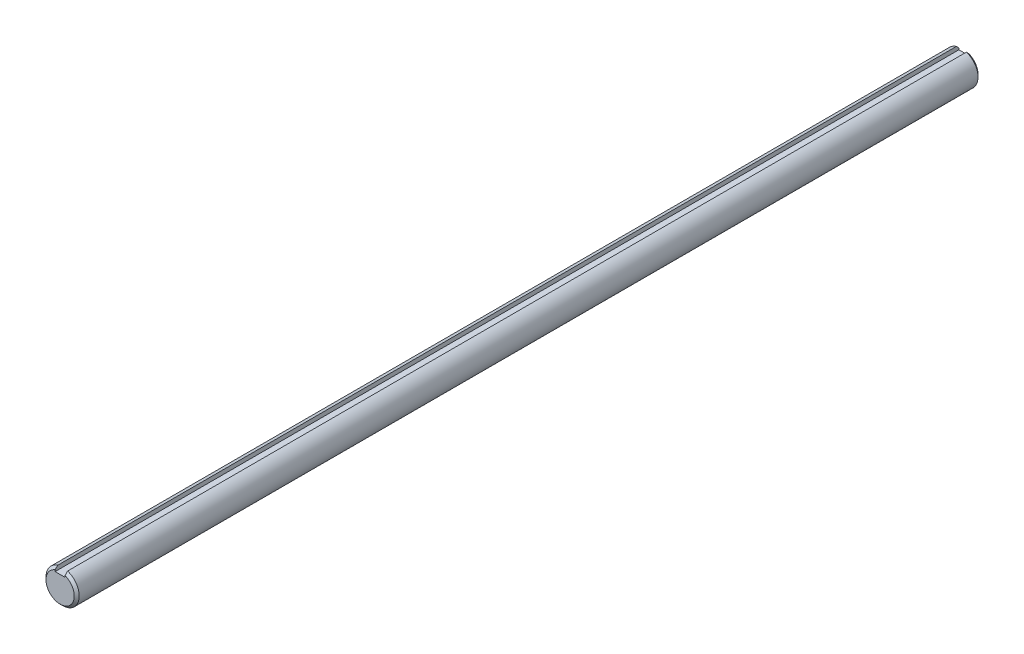
ISO-10303-21;
HEADER;
FILE_DESCRIPTION(('STEP AP214'),'2;1');
FILE_NAME('part.step','',(''),(''),'','','');
FILE_SCHEMA(('AUTOMOTIVE_DESIGN { 1 0 10303 214 1 1 1 1 }'));
ENDSEC;
DATA;
#1=APPLICATION_CONTEXT('core data for automotive mechanical design processes');
#2=APPLICATION_PROTOCOL_DEFINITION('international standard','automotive_design',2000,#1);
#3=PRODUCT_CONTEXT('',#1,'mechanical');
#4=PRODUCT('Part','Part','',(#3));
#5=PRODUCT_RELATED_PRODUCT_CATEGORY('part','',(#4));
#6=PRODUCT_DEFINITION_FORMATION('','',#4);
#7=PRODUCT_DEFINITION_CONTEXT('part definition',#1,'design');
#8=PRODUCT_DEFINITION('design','',#6,#7);
#9=PRODUCT_DEFINITION_SHAPE('','',#8);
#10=(LENGTH_UNIT() NAMED_UNIT(*) SI_UNIT(.MILLI.,.METRE.));
#11=(NAMED_UNIT(*) PLANE_ANGLE_UNIT() SI_UNIT($,.RADIAN.));
#12=(NAMED_UNIT(*) SI_UNIT($,.STERADIAN.) SOLID_ANGLE_UNIT());
#13=UNCERTAINTY_MEASURE_WITH_UNIT(LENGTH_MEASURE(1.E-05),#10,'distance_accuracy_value','');
#14=(GEOMETRIC_REPRESENTATION_CONTEXT(3) GLOBAL_UNCERTAINTY_ASSIGNED_CONTEXT((#13)) GLOBAL_UNIT_ASSIGNED_CONTEXT((#10,
#11,#12)) REPRESENTATION_CONTEXT('',''));
#15=CARTESIAN_POINT('',(0.,0.,0.));
#16=DIRECTION('',(0.,0.,1.));
#17=DIRECTION('',(1.,0.,0.));
#18=AXIS2_PLACEMENT_3D('',#15,#16,#17);
#19=CARTESIAN_POINT('',(0.,0.,107.95));
#20=DIRECTION('',(0.,0.,-1.));
#21=DIRECTION('',(-1.,0.,0.));
#22=AXIS2_PLACEMENT_3D('',#19,#20,#21);
#23=CYLINDRICAL_SURFACE('',#22,3.96875);
#24=CARTESIAN_POINT('',(0.,0.,107.3546875));
#25=DIRECTION('',(0.,0.,1.));
#26=DIRECTION('',(1.,0.,0.));
#27=AXIS2_PLACEMENT_3D('',#24,#25,#26);
#28=CIRCLE('',#27,3.96875);
#29=CARTESIAN_POINT('',(1.190625,3.7859462056235,107.3546875));
#30=VERTEX_POINT('',#29);
#31=CARTESIAN_POINT('',(-1.190625,3.7859462056235,107.3546875));
#32=VERTEX_POINT('',#31);
#33=EDGE_CURVE('E155',#30,#32,#28,.F.);
#34=ORIENTED_EDGE('',*,*,#33,.T.);
#35=DIRECTION('',(0.,0.,-1.));
#36=VECTOR('',#35,1.);
#37=CARTESIAN_POINT('',(-1.190625,3.7859462056235,107.95));
#38=LINE('',#37,#36);
#39=CARTESIAN_POINT('',(-1.190625,3.7859462056235,-107.3546875));
#40=VERTEX_POINT('',#39);
#41=EDGE_CURVE('E132',#32,#40,#38,.T.);
#42=ORIENTED_EDGE('',*,*,#41,.T.);
#43=CARTESIAN_POINT('',(0.,0.,-107.3546875));
#44=DIRECTION('',(0.,0.,1.));
#45=DIRECTION('',(1.,0.,0.));
#46=AXIS2_PLACEMENT_3D('',#43,#44,#45);
#47=CIRCLE('',#46,3.96875);
#48=CARTESIAN_POINT('',(1.190625,3.7859462056235,-107.3546875));
#49=VERTEX_POINT('',#48);
#50=EDGE_CURVE('E152',#40,#49,#47,.T.);
#51=ORIENTED_EDGE('',*,*,#50,.T.);
#52=DIRECTION('',(0.,0.,-1.));
#53=VECTOR('',#52,1.);
#54=CARTESIAN_POINT('',(1.190625,3.7859462056235,107.95));
#55=LINE('',#54,#53);
#56=EDGE_CURVE('E121',#49,#30,#55,.F.);
#57=ORIENTED_EDGE('',*,*,#56,.T.);
#58=EDGE_LOOP('',(#34,#42,#51,#57));
#59=FACE_BOUND('',#58,.T.);
#60=ADVANCED_FACE('F35',(#59),#23,.T.);
#61=CARTESIAN_POINT('',(0.,0.,107.95));
#62=DIRECTION('',(0.,0.,1.));
#63=DIRECTION('',(1.,0.,0.));
#64=AXIS2_PLACEMENT_3D('',#61,#62,#63);
#65=PLANE('',#64);
#66=DIRECTION('',(0.,-1.,0.));
#67=VECTOR('',#66,1.);
#68=CARTESIAN_POINT('',(-1.190625,3.96875,107.95));
#69=LINE('',#68,#67);
#70=CARTESIAN_POINT('',(-1.190625,3.15634166017892,107.95));
#71=VERTEX_POINT('',#70);
#72=CARTESIAN_POINT('',(-1.190625,2.778125,107.95));
#73=VERTEX_POINT('',#72);
#74=EDGE_CURVE('E91',#71,#73,#69,.T.);
#75=ORIENTED_EDGE('',*,*,#74,.F.);
#76=CARTESIAN_POINT('',(0.,0.,107.95));
#77=DIRECTION('',(0.,0.,1.));
#78=DIRECTION('',(1.,0.,0.));
#79=AXIS2_PLACEMENT_3D('',#76,#77,#78);
#80=CIRCLE('',#79,3.37343749999997);
#81=CARTESIAN_POINT('',(1.190625,3.15634166017892,107.95));
#82=VERTEX_POINT('',#81);
#83=EDGE_CURVE('E147',#71,#82,#80,.T.);
#84=ORIENTED_EDGE('',*,*,#83,.T.);
#85=DIRECTION('',(0.,1.,0.));
#86=VECTOR('',#85,1.);
#87=CARTESIAN_POINT('',(1.190625,3.96875,107.95));
#88=LINE('',#87,#86);
#89=CARTESIAN_POINT('',(1.190625,2.778125,107.95));
#90=VERTEX_POINT('',#89);
#91=EDGE_CURVE('E56',#90,#82,#88,.T.);
#92=ORIENTED_EDGE('',*,*,#91,.F.);
#93=DIRECTION('',(1.,0.,0.));
#94=VECTOR('',#93,1.);
#95=CARTESIAN_POINT('',(-1.190625,2.778125,107.95));
#96=LINE('',#95,#94);
#97=EDGE_CURVE('E101',#73,#90,#96,.T.);
#98=ORIENTED_EDGE('',*,*,#97,.F.);
#99=EDGE_LOOP('',(#75,#84,#92,#98));
#100=FACE_BOUND('',#99,.T.);
#101=ADVANCED_FACE('F112',(#100),#65,.T.);
#102=CARTESIAN_POINT('',(0.,0.,-107.95));
#103=DIRECTION('',(0.,0.,1.));
#104=DIRECTION('',(1.,0.,0.));
#105=AXIS2_PLACEMENT_3D('',#102,#103,#104);
#106=PLANE('',#105);
#107=CARTESIAN_POINT('',(0.,0.,-107.95));
#108=DIRECTION('',(0.,0.,1.));
#109=DIRECTION('',(1.,0.,0.));
#110=AXIS2_PLACEMENT_3D('',#107,#108,#109);
#111=CIRCLE('',#110,3.37343749999994);
#112=CARTESIAN_POINT('',(1.190625,3.15634166017889,-107.95));
#113=VERTEX_POINT('',#112);
#114=CARTESIAN_POINT('',(-1.190625,3.15634166017889,-107.95));
#115=VERTEX_POINT('',#114);
#116=EDGE_CURVE('E149',#113,#115,#111,.F.);
#117=ORIENTED_EDGE('',*,*,#116,.T.);
#118=DIRECTION('',(0.,-1.,0.));
#119=VECTOR('',#118,1.);
#120=CARTESIAN_POINT('',(-1.190625,3.96875,-107.95));
#121=LINE('',#120,#119);
#122=CARTESIAN_POINT('',(-1.190625,2.778125,-107.95));
#123=VERTEX_POINT('',#122);
#124=EDGE_CURVE('E114',#115,#123,#121,.T.);
#125=ORIENTED_EDGE('',*,*,#124,.T.);
#126=DIRECTION('',(1.,0.,0.));
#127=VECTOR('',#126,1.);
#128=CARTESIAN_POINT('',(-1.190625,2.778125,-107.95));
#129=LINE('',#128,#127);
#130=CARTESIAN_POINT('',(1.190625,2.778125,-107.95));
#131=VERTEX_POINT('',#130);
#132=EDGE_CURVE('E107',#123,#131,#129,.T.);
#133=ORIENTED_EDGE('',*,*,#132,.T.);
#134=DIRECTION('',(0.,1.,0.));
#135=VECTOR('',#134,1.);
#136=CARTESIAN_POINT('',(1.190625,3.96875,-107.95));
#137=LINE('',#136,#135);
#138=EDGE_CURVE('E110',#131,#113,#137,.T.);
#139=ORIENTED_EDGE('',*,*,#138,.T.);
#140=EDGE_LOOP('',(#117,#125,#133,#139));
#141=FACE_BOUND('',#140,.T.);
#142=ADVANCED_FACE('F167',(#141),#106,.F.);
#143=CARTESIAN_POINT('',(0.,0.,-107.3546875));
#144=DIRECTION('',(0.,0.,1.));
#145=DIRECTION('',(1.,0.,0.));
#146=AXIS2_PLACEMENT_3D('',#143,#144,#145);
#147=CONICAL_SURFACE('',#146,3.96875,0.785398163397454);
#148=CARTESIAN_POINT('',(-1.190625,1.2705074744525,-109.582237588081));
#149=CARTESIAN_POINT('',(-1.190625,1.33945024904548,-109.531868938439));
#150=CARTESIAN_POINT('',(-1.190625,1.40752613197202,-109.480346457148));
#151=CARTESIAN_POINT('',(-1.190625,1.54227424816376,-109.375529482326));
#152=CARTESIAN_POINT('',(-1.190625,1.60894684967617,-109.322235463392));
#153=CARTESIAN_POINT('',(-1.190625,1.74121608357416,-109.214415306958));
#154=CARTESIAN_POINT('',(-1.190625,1.80681332303188,-109.159889909066));
#155=CARTESIAN_POINT('',(-1.190625,1.93719861894641,-109.049871504209));
#156=CARTESIAN_POINT('',(-1.190625,2.00198661313571,-108.994378423563));
#157=CARTESIAN_POINT('',(-1.190625,2.19528235369314,-108.826902563142));
#158=CARTESIAN_POINT('',(-1.190625,2.32284027776798,-108.713825177904));
#159=CARTESIAN_POINT('',(-1.190625,2.57632456032826,-108.485833314422));
#160=CARTESIAN_POINT('',(-1.190625,2.70225069588487,-108.370918589859));
#161=CARTESIAN_POINT('',(-1.190625,2.90117256513785,-108.187583111563));
#162=CARTESIAN_POINT('',(-1.190625,2.97454261353847,-108.119567727347));
#163=CARTESIAN_POINT('',(-1.190625,3.12096669374044,-107.98318126116));
#164=CARTESIAN_POINT('',(-1.190625,3.194020688981,-107.914810139951));
#165=CARTESIAN_POINT('',(-1.190625,3.42754855543194,-107.695403028298));
#166=CARTESIAN_POINT('',(-1.190625,3.58751214790997,-107.54382403118));
#167=CARTESIAN_POINT('',(-1.190625,3.9065646384522,-107.239747690829));
#168=CARTESIAN_POINT('',(-1.190625,4.06565352943566,-107.087250340184));
#169=CARTESIAN_POINT('',(-1.190625,4.38313242821709,-106.781678673975));
#170=CARTESIAN_POINT('',(-1.190625,4.54152272817578,-106.628604661738));
#171=CARTESIAN_POINT('',(-1.190625,4.85782857925871,-106.321974315725));
#172=CARTESIAN_POINT('',(-1.190625,5.0157441416509,-106.168417993577));
#173=CARTESIAN_POINT('',(-1.190625,5.17350075106821,-106.014699616856));
#174=B_SPLINE_CURVE_WITH_KNOTS('',3,(#148,#149,#150,#151,#152,#153,#154,#155,#156,#157,#158,
#159,#160,#161,#162,#163,#164,#165,#166,#167,#168,#169,#170,#171,#172,#173),.UNSPECIFIED.,.F.,
.F.,(4,2,2,2,2,2,2,2,2,2,2,2,4),(0.,0.256106549070278,0.512145031259662,0.768033616188476,
1.02394177069293,1.53529710027226,2.04672156801998,2.3468592131894,2.64703069635681,
3.30814528195856,3.96926521146619,4.63007582380794,5.29087062592851),.UNSPECIFIED.);
#175=EDGE_CURVE('E64',#115,#40,#174,.T.);
#176=ORIENTED_EDGE('',*,*,#175,.F.);
#177=ORIENTED_EDGE('',*,*,#116,.F.);
#178=CARTESIAN_POINT('',(1.190625,5.17350075106821,-106.014699616856));
#179=CARTESIAN_POINT('',(1.190625,5.01564874806207,-106.168511472319));
#180=CARTESIAN_POINT('',(1.190625,4.85763728715372,-106.322160583231));
#181=CARTESIAN_POINT('',(1.190625,4.54115596675193,-106.628959355939));
#182=CARTESIAN_POINT('',(1.190625,4.38268614660585,-106.782109058337));
#183=CARTESIAN_POINT('',(1.190625,4.06522276267555,-107.087664113955));
#184=CARTESIAN_POINT('',(1.190625,3.90622959354944,-107.240069876704));
#185=CARTESIAN_POINT('',(1.190625,3.58735074633396,-107.54397497985));
#186=CARTESIAN_POINT('',(1.190625,3.42746498744949,-107.695474235536));
#187=CARTESIAN_POINT('',(1.190625,3.10626227314188,-107.997269372935));
#188=CARTESIAN_POINT('',(1.190625,2.94494407029081,-108.147563931976));
#189=CARTESIAN_POINT('',(1.190625,2.70149890471547,-108.371373606125));
#190=CARTESIAN_POINT('',(1.190625,2.62011511899482,-108.445696526585));
#191=CARTESIAN_POINT('',(1.190625,2.45670633738342,-108.593641789475));
#192=CARTESIAN_POINT('',(1.190625,2.37468131578876,-108.667264103556));
#193=CARTESIAN_POINT('',(1.190625,2.20973257977102,-108.813645127679));
#194=CARTESIAN_POINT('',(1.190625,2.12680813490424,-108.886403016633));
#195=CARTESIAN_POINT('',(1.190625,1.95987008893629,-109.030642128344));
#196=CARTESIAN_POINT('',(1.190625,1.87585661113062,-109.102123493484));
#197=CARTESIAN_POINT('',(1.190625,1.70627140047754,-109.243357240029));
#198=CARTESIAN_POINT('',(1.190625,1.62069854908277,-109.313108288189));
#199=CARTESIAN_POINT('',(1.190625,1.490751438306,-109.415762040513));
#200=CARTESIAN_POINT('',(1.190625,1.44716267308548,-109.449657399673));
#201=CARTESIAN_POINT('',(1.190625,1.35934334622596,-109.516616073488));
#202=CARTESIAN_POINT('',(1.190625,1.31511270922793,-109.54967928918));
#203=CARTESIAN_POINT('',(1.190625,1.2705074744525,-109.582237588081));
#204=B_SPLINE_CURVE_WITH_KNOTS('',3,(#178,#179,#180,#181,#182,#183,#184,#185,#186,#187,#188,
#189,#190,#191,#192,#193,#194,#195,#196,#197,#198,#199,#200,#201,#202,#203),.UNSPECIFIED.,.F.,
.F.,(4,2,2,2,2,2,2,2,2,2,2,2,4),(0.,0.661195239000987,1.32233530998299,1.98305721589185,
2.64383993116428,3.30526927355018,3.63590949345567,3.96656303571753,4.29750891878851,
4.62841765531665,4.9595739066105,5.12521491207,5.29087552454029),.UNSPECIFIED.);
#205=EDGE_CURVE('E125',#49,#113,#204,.T.);
#206=ORIENTED_EDGE('',*,*,#205,.F.);
#207=ORIENTED_EDGE('',*,*,#50,.F.);
#208=EDGE_LOOP('',(#176,#177,#206,#207));
#209=FACE_BOUND('',#208,.T.);
#210=ADVANCED_FACE('F134',(#209),#147,.T.);
#211=CARTESIAN_POINT('',(0.,0.,107.95));
#212=DIRECTION('',(0.,0.,-1.));
#213=DIRECTION('',(-1.,0.,0.));
#214=AXIS2_PLACEMENT_3D('',#211,#212,#213);
#215=CONICAL_SURFACE('',#214,3.37343749999997,0.785398163397466);
#216=CARTESIAN_POINT('',(-1.190625,5.17350075106823,106.014699616856));
#217=CARTESIAN_POINT('',(-1.190625,5.0156487480621,106.168511472319));
#218=CARTESIAN_POINT('',(-1.190625,4.85763728715374,106.322160583231));
#219=CARTESIAN_POINT('',(-1.190625,4.54115596675196,106.628959355939));
#220=CARTESIAN_POINT('',(-1.190625,4.38268614660587,106.782109058337));
#221=CARTESIAN_POINT('',(-1.190625,4.06522276267557,107.087664113955));
#222=CARTESIAN_POINT('',(-1.190625,3.90622959354946,107.240069876704));
#223=CARTESIAN_POINT('',(-1.190625,3.58735074633397,107.54397497985));
#224=CARTESIAN_POINT('',(-1.190625,3.42746498744951,107.695474235536));
#225=CARTESIAN_POINT('',(-1.190625,3.10626227314189,107.997269372935));
#226=CARTESIAN_POINT('',(-1.190625,2.94494407029082,108.147563931976));
#227=CARTESIAN_POINT('',(-1.190625,2.70149890471548,108.371373606125));
#228=CARTESIAN_POINT('',(-1.190625,2.62011511899483,108.445696526585));
#229=CARTESIAN_POINT('',(-1.190625,2.45670633738343,108.593641789475));
#230=CARTESIAN_POINT('',(-1.190625,2.37468131578877,108.667264103556));
#231=CARTESIAN_POINT('',(-1.190625,2.20973257977104,108.813645127679));
#232=CARTESIAN_POINT('',(-1.190625,2.12680813490426,108.886403016633));
#233=CARTESIAN_POINT('',(-1.190625,1.9598700889363,109.030642128344));
#234=CARTESIAN_POINT('',(-1.190625,1.87585661113062,109.102123493484));
#235=CARTESIAN_POINT('',(-1.190625,1.70627140047756,109.243357240029));
#236=CARTESIAN_POINT('',(-1.190625,1.62069854908278,109.313108288189));
#237=CARTESIAN_POINT('',(-1.190625,1.49075143830601,109.415762040513));
#238=CARTESIAN_POINT('',(-1.190625,1.44716267308549,109.449657399673));
#239=CARTESIAN_POINT('',(-1.190625,1.35934334622596,109.516616073488));
#240=CARTESIAN_POINT('',(-1.190625,1.31511270922793,109.54967928918));
#241=CARTESIAN_POINT('',(-1.190625,1.27050747445251,109.582237588081));
#242=B_SPLINE_CURVE_WITH_KNOTS('',3,(#216,#217,#218,#219,#220,#221,#222,#223,#224,#225,#226,
#227,#228,#229,#230,#231,#232,#233,#234,#235,#236,#237,#238,#239,#240,#241),.UNSPECIFIED.,.F.,
.F.,(4,2,2,2,2,2,2,2,2,2,2,2,4),(0.,0.661195239000971,1.32233530998297,1.98305721589184,
2.64383993116425,3.30526927355016,3.63590949345565,3.9665630357175,4.29750891878847,
4.62841765531661,4.95957390661045,5.12521491206996,5.29087552454025),.UNSPECIFIED.);
#243=EDGE_CURVE('E11',#32,#71,#242,.T.);
#244=ORIENTED_EDGE('',*,*,#243,.F.);
#245=ORIENTED_EDGE('',*,*,#33,.F.);
#246=CARTESIAN_POINT('',(1.190625,1.27050747445251,109.582237588081));
#247=CARTESIAN_POINT('',(1.190625,1.33945024904549,109.531868938439));
#248=CARTESIAN_POINT('',(1.190625,1.40752613197203,109.480346457148));
#249=CARTESIAN_POINT('',(1.190625,1.54227424816377,109.375529482326));
#250=CARTESIAN_POINT('',(1.190625,1.60894684967617,109.322235463392));
#251=CARTESIAN_POINT('',(1.190625,1.74121608357416,109.214415306958));
#252=CARTESIAN_POINT('',(1.190625,1.80681332303189,109.159889909066));
#253=CARTESIAN_POINT('',(1.190625,1.93719861894641,109.049871504209));
#254=CARTESIAN_POINT('',(1.190625,2.00198661313572,108.994378423563));
#255=CARTESIAN_POINT('',(1.190625,2.19528235369314,108.826902563142));
#256=CARTESIAN_POINT('',(1.190625,2.32284027776798,108.713825177904));
#257=CARTESIAN_POINT('',(1.190625,2.57632456032828,108.485833314422));
#258=CARTESIAN_POINT('',(1.190625,2.70225069588489,108.370918589859));
#259=CARTESIAN_POINT('',(1.190625,2.90117256513788,108.187583111563));
#260=CARTESIAN_POINT('',(1.190625,2.97454261353849,108.119567727347));
#261=CARTESIAN_POINT('',(1.190625,3.12096669374046,107.98318126116));
#262=CARTESIAN_POINT('',(1.190625,3.19402068898102,107.914810139951));
#263=CARTESIAN_POINT('',(1.190625,3.42754855543196,107.695403028298));
#264=CARTESIAN_POINT('',(1.190625,3.58751214790999,107.54382403118));
#265=CARTESIAN_POINT('',(1.190625,3.90656463845222,107.239747690829));
#266=CARTESIAN_POINT('',(1.190625,4.06565352943568,107.087250340184));
#267=CARTESIAN_POINT('',(1.190625,4.38313242821712,106.781678673975));
#268=CARTESIAN_POINT('',(1.190625,4.5415227281758,106.628604661738));
#269=CARTESIAN_POINT('',(1.190625,4.85782857925873,106.321974315725));
#270=CARTESIAN_POINT('',(1.190625,5.01574414165091,106.168417993577));
#271=CARTESIAN_POINT('',(1.190625,5.17350075106823,106.014699616856));
#272=B_SPLINE_CURVE_WITH_KNOTS('',3,(#246,#247,#248,#249,#250,#251,#252,#253,#254,#255,#256,
#257,#258,#259,#260,#261,#262,#263,#264,#265,#266,#267,#268,#269,#270,#271),.UNSPECIFIED.,.F.,
.F.,(4,2,2,2,2,2,2,2,2,2,2,2,4),(0.,0.256106549070279,0.512145031259646,0.768033616188462,
1.02394177069292,1.53529710027225,2.04672156801997,2.3468592131894,2.6470306963568,
3.30814528195854,3.96926521146616,4.63007582380791,5.29087062592846),.UNSPECIFIED.);
#273=EDGE_CURVE('E49',#82,#30,#272,.T.);
#274=ORIENTED_EDGE('',*,*,#273,.F.);
#275=ORIENTED_EDGE('',*,*,#83,.F.);
#276=EDGE_LOOP('',(#244,#245,#274,#275));
#277=FACE_BOUND('',#276,.T.);
#278=ADVANCED_FACE('F37',(#277),#215,.T.);
#279=CARTESIAN_POINT('',(-1.190625,3.96875,-107.95));
#280=DIRECTION('',(-1.,0.,0.));
#281=DIRECTION('',(0.,-1.,0.));
#282=AXIS2_PLACEMENT_3D('',#279,#280,#281);
#283=PLANE('',#282);
#284=ORIENTED_EDGE('',*,*,#175,.T.);
#285=ORIENTED_EDGE('',*,*,#41,.F.);
#286=ORIENTED_EDGE('',*,*,#243,.T.);
#287=ORIENTED_EDGE('',*,*,#74,.T.);
#288=DIRECTION('',(0.,0.,1.));
#289=VECTOR('',#288,1.);
#290=CARTESIAN_POINT('',(-1.190625,2.778125,-107.95));
#291=LINE('',#290,#289);
#292=EDGE_CURVE('E94',#123,#73,#291,.T.);
#293=ORIENTED_EDGE('',*,*,#292,.F.);
#294=ORIENTED_EDGE('',*,*,#124,.F.);
#295=EDGE_LOOP('',(#284,#285,#286,#287,#293,#294));
#296=FACE_BOUND('',#295,.T.);
#297=ADVANCED_FACE('F93',(#296),#283,.F.);
#298=CARTESIAN_POINT('',(1.190625,3.96875,-107.95));
#299=DIRECTION('',(1.,0.,0.));
#300=DIRECTION('',(0.,1.,0.));
#301=AXIS2_PLACEMENT_3D('',#298,#299,#300);
#302=PLANE('',#301);
#303=ORIENTED_EDGE('',*,*,#205,.T.);
#304=ORIENTED_EDGE('',*,*,#138,.F.);
#305=DIRECTION('',(0.,0.,1.));
#306=VECTOR('',#305,1.);
#307=CARTESIAN_POINT('',(1.190625,2.778125,-107.95));
#308=LINE('',#307,#306);
#309=EDGE_CURVE('E109',#131,#90,#308,.T.);
#310=ORIENTED_EDGE('',*,*,#309,.T.);
#311=ORIENTED_EDGE('',*,*,#91,.T.);
#312=ORIENTED_EDGE('',*,*,#273,.T.);
#313=ORIENTED_EDGE('',*,*,#56,.F.);
#314=EDGE_LOOP('',(#303,#304,#310,#311,#312,#313));
#315=FACE_BOUND('',#314,.T.);
#316=ADVANCED_FACE('F137',(#315),#302,.F.);
#317=CARTESIAN_POINT('',(-1.190625,2.778125,-107.95));
#318=DIRECTION('',(0.,-1.,0.));
#319=DIRECTION('',(0.,0.,-1.));
#320=AXIS2_PLACEMENT_3D('',#317,#318,#319);
#321=PLANE('',#320);
#322=ORIENTED_EDGE('',*,*,#309,.F.);
#323=ORIENTED_EDGE('',*,*,#132,.F.);
#324=ORIENTED_EDGE('',*,*,#292,.T.);
#325=ORIENTED_EDGE('',*,*,#97,.T.);
#326=EDGE_LOOP('',(#322,#323,#324,#325));
#327=FACE_BOUND('',#326,.T.);
#328=ADVANCED_FACE('F105',(#327),#321,.F.);
#329=CLOSED_SHELL('',(#60,#101,#142,#210,#278,#297,#316,#328));
#330=MANIFOLD_SOLID_BREP('B2',#329);
#331=ADVANCED_BREP_SHAPE_REPRESENTATION('',(#18,#330),#14);
#332=SHAPE_DEFINITION_REPRESENTATION(#9,#331);
ENDSEC;
END-ISO-10303-21;
